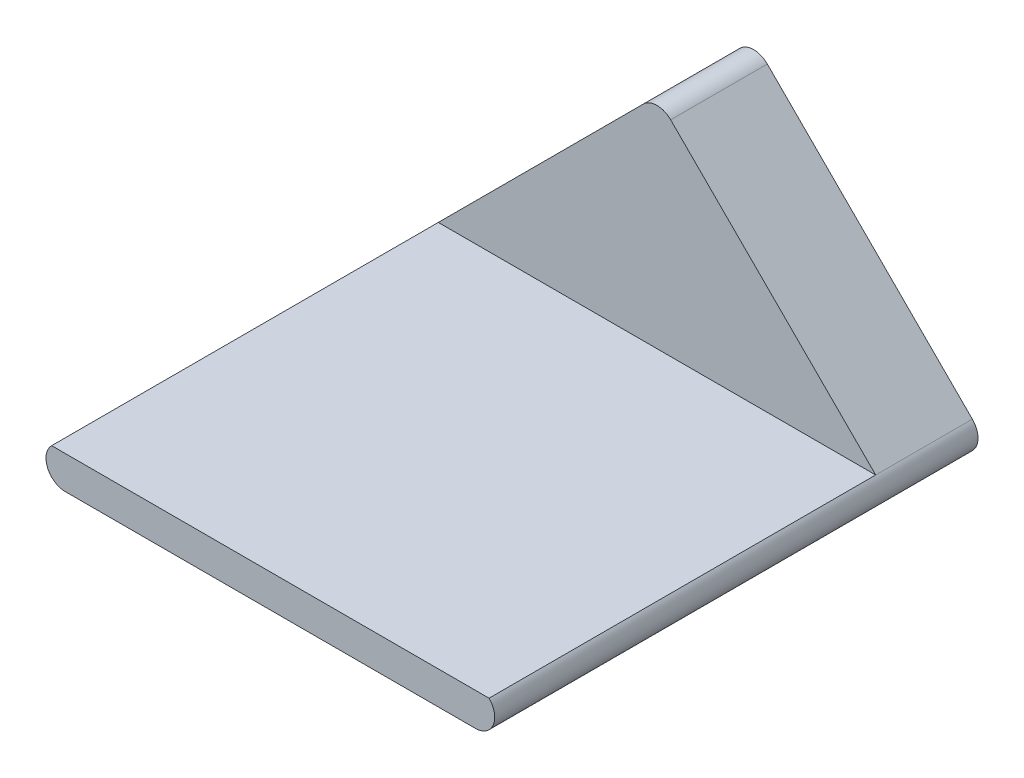
ISO-10303-21;
HEADER;
FILE_DESCRIPTION(('STEP AP214'),'2;1');
FILE_NAME('part.step','',(''),(''),'','','');
FILE_SCHEMA(('AUTOMOTIVE_DESIGN { 1 0 10303 214 1 1 1 1 }'));
ENDSEC;
DATA;
#1=APPLICATION_CONTEXT('core data for automotive mechanical design processes');
#2=APPLICATION_PROTOCOL_DEFINITION('international standard','automotive_design',2000,#1);
#3=PRODUCT_CONTEXT('',#1,'mechanical');
#4=PRODUCT('Part','Part','',(#3));
#5=PRODUCT_RELATED_PRODUCT_CATEGORY('part','',(#4));
#6=PRODUCT_DEFINITION_FORMATION('','',#4);
#7=PRODUCT_DEFINITION_CONTEXT('part definition',#1,'design');
#8=PRODUCT_DEFINITION('design','',#6,#7);
#9=PRODUCT_DEFINITION_SHAPE('','',#8);
#10=(LENGTH_UNIT() NAMED_UNIT(*) SI_UNIT(.MILLI.,.METRE.));
#11=(NAMED_UNIT(*) PLANE_ANGLE_UNIT() SI_UNIT($,.RADIAN.));
#12=(NAMED_UNIT(*) SI_UNIT($,.STERADIAN.) SOLID_ANGLE_UNIT());
#13=UNCERTAINTY_MEASURE_WITH_UNIT(LENGTH_MEASURE(1.E-05),#10,'distance_accuracy_value','');
#14=(GEOMETRIC_REPRESENTATION_CONTEXT(3) GLOBAL_UNCERTAINTY_ASSIGNED_CONTEXT((#13)) GLOBAL_UNIT_ASSIGNED_CONTEXT((#10,
#11,#12)) REPRESENTATION_CONTEXT('',''));
#15=CARTESIAN_POINT('',(0.,0.,0.));
#16=DIRECTION('',(0.,0.,1.));
#17=DIRECTION('',(1.,0.,0.));
#18=AXIS2_PLACEMENT_3D('',#15,#16,#17);
#19=CARTESIAN_POINT('',(0.,3.41421356237313,50.));
#20=DIRECTION('',(0.,1.,0.));
#21=DIRECTION('',(-1.,0.,0.));
#22=AXIS2_PLACEMENT_3D('',#19,#20,#21);
#23=PLANE('',#22);
#24=DIRECTION('',(1.,0.,0.));
#25=VECTOR('',#24,1.);
#26=CARTESIAN_POINT('',(0.,3.41421356237313,10.));
#27=LINE('',#26,#25);
#28=CARTESIAN_POINT('',(3.41421356237311,3.41421356237313,9.99999999999999));
#29=VERTEX_POINT('',#28);
#30=CARTESIAN_POINT('',(48.6690475583122,3.41421356237311,10.));
#31=VERTEX_POINT('',#30);
#32=EDGE_CURVE('E56',#29,#31,#27,.T.);
#33=ORIENTED_EDGE('',*,*,#32,.F.);
#34=DIRECTION('',(0.,0.,-1.));
#35=VECTOR('',#34,1.);
#36=CARTESIAN_POINT('',(3.41421356237311,3.41421356237313,50.));
#37=LINE('',#36,#35);
#38=CARTESIAN_POINT('',(3.41421356237311,3.41421356237313,50.));
#39=VERTEX_POINT('',#38);
#40=EDGE_CURVE('E11',#39,#29,#37,.T.);
#41=ORIENTED_EDGE('',*,*,#40,.F.);
#42=DIRECTION('',(1.,0.,0.));
#43=VECTOR('',#42,1.);
#44=CARTESIAN_POINT('',(0.,3.41421356237313,50.));
#45=LINE('',#44,#43);
#46=CARTESIAN_POINT('',(48.6690475583122,3.41421356237311,50.));
#47=VERTEX_POINT('',#46);
#48=EDGE_CURVE('E153',#39,#47,#45,.T.);
#49=ORIENTED_EDGE('',*,*,#48,.T.);
#50=DIRECTION('',(0.,0.,-1.));
#51=VECTOR('',#50,1.);
#52=CARTESIAN_POINT('',(48.6690475583122,3.41421356237311,50.));
#53=LINE('',#52,#51);
#54=EDGE_CURVE('E63',#47,#31,#53,.T.);
#55=ORIENTED_EDGE('',*,*,#54,.T.);
#56=EDGE_LOOP('',(#33,#41,#49,#55));
#57=FACE_BOUND('',#56,.T.);
#58=ADVANCED_FACE('F41',(#57),#23,.T.);
#59=CARTESIAN_POINT('',(4.82842712474618,2.,50.));
#60=DIRECTION('',(0.,0.,-1.));
#61=DIRECTION('',(-1.,0.,0.));
#62=AXIS2_PLACEMENT_3D('',#59,#60,#61);
#63=CYLINDRICAL_SURFACE('',#62,2.);
#64=CARTESIAN_POINT('',(4.82842712474618,2.,0.));
#65=DIRECTION('',(0.,0.,1.));
#66=DIRECTION('',(1.,0.,0.));
#67=AXIS2_PLACEMENT_3D('',#64,#65,#66);
#68=CIRCLE('',#67,2.);
#69=CARTESIAN_POINT('',(3.41421356237311,3.41421356237313,0.));
#70=VERTEX_POINT('',#69);
#71=CARTESIAN_POINT('',(4.82842712474623,0.,0.));
#72=VERTEX_POINT('',#71);
#73=EDGE_CURVE('E116',#70,#72,#68,.T.);
#74=ORIENTED_EDGE('',*,*,#73,.T.);
#75=DIRECTION('',(0.,0.,-1.));
#76=VECTOR('',#75,1.);
#77=CARTESIAN_POINT('',(4.82842712474623,0.,50.));
#78=LINE('',#77,#76);
#79=CARTESIAN_POINT('',(4.82842712474623,0.,50.));
#80=VERTEX_POINT('',#79);
#81=EDGE_CURVE('E49',#80,#72,#78,.T.);
#82=ORIENTED_EDGE('',*,*,#81,.F.);
#83=CARTESIAN_POINT('',(4.82842712474618,2.,50.));
#84=DIRECTION('',(0.,0.,1.));
#85=DIRECTION('',(1.,0.,0.));
#86=AXIS2_PLACEMENT_3D('',#83,#84,#85);
#87=CIRCLE('',#86,2.);
#88=EDGE_CURVE('E156',#39,#80,#87,.T.);
#89=ORIENTED_EDGE('',*,*,#88,.F.);
#90=ORIENTED_EDGE('',*,*,#40,.T.);
#91=DIRECTION('',(0.,0.,-1.));
#92=VECTOR('',#91,1.);
#93=CARTESIAN_POINT('',(3.41421356237311,3.41421356237313,10.));
#94=LINE('',#93,#92);
#95=EDGE_CURVE('E117',#29,#70,#94,.T.);
#96=ORIENTED_EDGE('',*,*,#95,.T.);
#97=EDGE_LOOP('',(#74,#82,#89,#90,#96));
#98=FACE_BOUND('',#97,.T.);
#99=ADVANCED_FACE('F187',(#98),#63,.T.);
#100=CARTESIAN_POINT('',(0.,0.,50.));
#101=DIRECTION('',(0.,-1.,0.));
#102=DIRECTION('',(1.,0.,0.));
#103=AXIS2_PLACEMENT_3D('',#100,#101,#102);
#104=PLANE('',#103);
#105=DIRECTION('',(-1.,0.,0.));
#106=VECTOR('',#105,1.);
#107=CARTESIAN_POINT('',(0.,0.,0.));
#108=LINE('',#107,#106);
#109=CARTESIAN_POINT('',(47.2548339959391,0.,0.));
#110=VERTEX_POINT('',#109);
#111=EDGE_CURVE('E169',#110,#72,#108,.T.);
#112=ORIENTED_EDGE('',*,*,#111,.F.);
#113=DIRECTION('',(0.,0.,-1.));
#114=VECTOR('',#113,1.);
#115=CARTESIAN_POINT('',(47.2548339959391,0.,50.));
#116=LINE('',#115,#114);
#117=CARTESIAN_POINT('',(47.2548339959391,0.,50.));
#118=VERTEX_POINT('',#117);
#119=EDGE_CURVE('E177',#118,#110,#116,.T.);
#120=ORIENTED_EDGE('',*,*,#119,.F.);
#121=DIRECTION('',(-1.,0.,0.));
#122=VECTOR('',#121,1.);
#123=CARTESIAN_POINT('',(0.,0.,50.));
#124=LINE('',#123,#122);
#125=EDGE_CURVE('E159',#118,#80,#124,.T.);
#126=ORIENTED_EDGE('',*,*,#125,.T.);
#127=ORIENTED_EDGE('',*,*,#81,.T.);
#128=EDGE_LOOP('',(#112,#120,#126,#127));
#129=FACE_BOUND('',#128,.T.);
#130=ADVANCED_FACE('F183',(#129),#104,.T.);
#131=CARTESIAN_POINT('',(47.2548339959391,2.00000000000001,50.));
#132=DIRECTION('',(0.,0.,-1.));
#133=DIRECTION('',(-1.,0.,0.));
#134=AXIS2_PLACEMENT_3D('',#131,#132,#133);
#135=CYLINDRICAL_SURFACE('',#134,2.);
#136=CARTESIAN_POINT('',(47.2548339959391,2.00000000000001,0.));
#137=DIRECTION('',(0.,0.,1.));
#138=DIRECTION('',(1.,0.,0.));
#139=AXIS2_PLACEMENT_3D('',#136,#137,#138);
#140=CIRCLE('',#139,2.);
#141=CARTESIAN_POINT('',(48.6690475583122,3.41421356237311,0.));
#142=VERTEX_POINT('',#141);
#143=EDGE_CURVE('E83',#142,#110,#140,.F.);
#144=ORIENTED_EDGE('',*,*,#143,.F.);
#145=DIRECTION('',(0.,0.,-1.));
#146=VECTOR('',#145,1.);
#147=CARTESIAN_POINT('',(48.6690475583122,3.41421356237311,10.));
#148=LINE('',#147,#146);
#149=EDGE_CURVE('E148',#31,#142,#148,.T.);
#150=ORIENTED_EDGE('',*,*,#149,.F.);
#151=ORIENTED_EDGE('',*,*,#54,.F.);
#152=CARTESIAN_POINT('',(47.2548339959391,2.00000000000001,50.));
#153=DIRECTION('',(0.,0.,1.));
#154=DIRECTION('',(1.,0.,0.));
#155=AXIS2_PLACEMENT_3D('',#152,#153,#154);
#156=CIRCLE('',#155,2.);
#157=EDGE_CURVE('E163',#47,#118,#156,.F.);
#158=ORIENTED_EDGE('',*,*,#157,.T.);
#159=ORIENTED_EDGE('',*,*,#119,.T.);
#160=EDGE_LOOP('',(#144,#150,#151,#158,#159));
#161=FACE_BOUND('',#160,.T.);
#162=ADVANCED_FACE('F193',(#161),#135,.T.);
#163=CARTESIAN_POINT('',(0.,0.,50.));
#164=DIRECTION('',(0.,0.,1.));
#165=DIRECTION('',(1.,0.,0.));
#166=AXIS2_PLACEMENT_3D('',#163,#164,#165);
#167=PLANE('',#166);
#168=ORIENTED_EDGE('',*,*,#48,.F.);
#169=ORIENTED_EDGE('',*,*,#88,.T.);
#170=ORIENTED_EDGE('',*,*,#125,.F.);
#171=ORIENTED_EDGE('',*,*,#157,.F.);
#172=EDGE_LOOP('',(#168,#169,#170,#171));
#173=FACE_BOUND('',#172,.T.);
#174=ADVANCED_FACE('F195',(#173),#167,.T.);
#175=CARTESIAN_POINT('',(0.,0.,0.));
#176=DIRECTION('',(0.,0.,1.));
#177=DIRECTION('',(1.,0.,0.));
#178=AXIS2_PLACEMENT_3D('',#175,#176,#177);
#179=PLANE('',#178);
#180=ORIENTED_EDGE('',*,*,#73,.F.);
#181=DIRECTION('',(0.707106781186547,0.707106781186548,0.));
#182=VECTOR('',#181,1.);
#183=CARTESIAN_POINT('',(0.,0.,0.));
#184=LINE('',#183,#182);
#185=CARTESIAN_POINT('',(24.6274169979695,24.6274169979696,0.));
#186=VERTEX_POINT('',#185);
#187=EDGE_CURVE('E140',#70,#186,#184,.T.);
#188=ORIENTED_EDGE('',*,*,#187,.T.);
#189=CARTESIAN_POINT('',(26.0416305603426,23.2132034355965,0.));
#190=DIRECTION('',(0.,0.,1.));
#191=DIRECTION('',(1.,0.,0.));
#192=AXIS2_PLACEMENT_3D('',#189,#190,#191);
#193=CIRCLE('',#192,2.);
#194=CARTESIAN_POINT('',(27.4558441227157,24.6274169979695,0.));
#195=VERTEX_POINT('',#194);
#196=EDGE_CURVE('E110',#186,#195,#193,.F.);
#197=ORIENTED_EDGE('',*,*,#196,.T.);
#198=DIRECTION('',(0.707106781186548,-0.707106781186547,0.));
#199=VECTOR('',#198,1.);
#200=CARTESIAN_POINT('',(26.0416305603426,26.0416305603426,0.));
#201=LINE('',#200,#199);
#202=EDGE_CURVE('E126',#195,#142,#201,.T.);
#203=ORIENTED_EDGE('',*,*,#202,.T.);
#204=ORIENTED_EDGE('',*,*,#143,.T.);
#205=ORIENTED_EDGE('',*,*,#111,.T.);
#206=EDGE_LOOP('',(#180,#188,#197,#203,#204,#205));
#207=FACE_BOUND('',#206,.T.);
#208=ADVANCED_FACE('F189',(#207),#179,.F.);
#209=CARTESIAN_POINT('',(26.0416305603426,23.2132034355965,10.));
#210=DIRECTION('',(0.,0.,-1.));
#211=DIRECTION('',(-1.,0.,0.));
#212=AXIS2_PLACEMENT_3D('',#209,#210,#211);
#213=CYLINDRICAL_SURFACE('',#212,2.);
#214=ORIENTED_EDGE('',*,*,#196,.F.);
#215=DIRECTION('',(0.,0.,-1.));
#216=VECTOR('',#215,1.);
#217=CARTESIAN_POINT('',(24.6274169979695,24.6274169979696,10.));
#218=LINE('',#217,#216);
#219=CARTESIAN_POINT('',(24.6274169979695,24.6274169979696,10.));
#220=VERTEX_POINT('',#219);
#221=EDGE_CURVE('E104',#220,#186,#218,.T.);
#222=ORIENTED_EDGE('',*,*,#221,.F.);
#223=CARTESIAN_POINT('',(26.0416305603426,23.2132034355965,10.));
#224=DIRECTION('',(0.,0.,1.));
#225=DIRECTION('',(1.,0.,0.));
#226=AXIS2_PLACEMENT_3D('',#223,#224,#225);
#227=CIRCLE('',#226,2.);
#228=CARTESIAN_POINT('',(27.4558441227157,24.6274169979695,10.));
#229=VERTEX_POINT('',#228);
#230=EDGE_CURVE('E107',#220,#229,#227,.F.);
#231=ORIENTED_EDGE('',*,*,#230,.T.);
#232=DIRECTION('',(0.,0.,-1.));
#233=VECTOR('',#232,1.);
#234=CARTESIAN_POINT('',(27.4558441227157,24.6274169979695,10.));
#235=LINE('',#234,#233);
#236=EDGE_CURVE('E137',#229,#195,#235,.T.);
#237=ORIENTED_EDGE('',*,*,#236,.T.);
#238=EDGE_LOOP('',(#214,#222,#231,#237));
#239=FACE_BOUND('',#238,.T.);
#240=ADVANCED_FACE('F106',(#239),#213,.T.);
#241=CARTESIAN_POINT('',(0.,0.,10.));
#242=DIRECTION('',(-0.707106781186548,0.707106781186547,0.));
#243=DIRECTION('',(-0.707106781186547,-0.707106781186548,0.));
#244=AXIS2_PLACEMENT_3D('',#241,#242,#243);
#245=PLANE('',#244);
#246=ORIENTED_EDGE('',*,*,#187,.F.);
#247=ORIENTED_EDGE('',*,*,#95,.F.);
#248=DIRECTION('',(0.707106781186547,0.707106781186548,0.));
#249=VECTOR('',#248,1.);
#250=CARTESIAN_POINT('',(0.,0.,10.));
#251=LINE('',#250,#249);
#252=EDGE_CURVE('E122',#29,#220,#251,.T.);
#253=ORIENTED_EDGE('',*,*,#252,.T.);
#254=ORIENTED_EDGE('',*,*,#221,.T.);
#255=EDGE_LOOP('',(#246,#247,#253,#254));
#256=FACE_BOUND('',#255,.T.);
#257=ADVANCED_FACE('F129',(#256),#245,.T.);
#258=CARTESIAN_POINT('',(26.0416305603426,26.0416305603426,10.));
#259=DIRECTION('',(0.707106781186547,0.707106781186548,0.));
#260=DIRECTION('',(-0.707106781186548,0.707106781186547,0.));
#261=AXIS2_PLACEMENT_3D('',#258,#259,#260);
#262=PLANE('',#261);
#263=ORIENTED_EDGE('',*,*,#202,.F.);
#264=ORIENTED_EDGE('',*,*,#236,.F.);
#265=DIRECTION('',(0.707106781186548,-0.707106781186547,0.));
#266=VECTOR('',#265,1.);
#267=CARTESIAN_POINT('',(26.0416305603426,26.0416305603426,10.));
#268=LINE('',#267,#266);
#269=EDGE_CURVE('E124',#229,#31,#268,.T.);
#270=ORIENTED_EDGE('',*,*,#269,.T.);
#271=ORIENTED_EDGE('',*,*,#149,.T.);
#272=EDGE_LOOP('',(#263,#264,#270,#271));
#273=FACE_BOUND('',#272,.T.);
#274=ADVANCED_FACE('F192',(#273),#262,.T.);
#275=CARTESIAN_POINT('',(0.,0.,10.));
#276=DIRECTION('',(0.,0.,1.));
#277=DIRECTION('',(1.,0.,0.));
#278=AXIS2_PLACEMENT_3D('',#275,#276,#277);
#279=PLANE('',#278);
#280=ORIENTED_EDGE('',*,*,#230,.F.);
#281=ORIENTED_EDGE('',*,*,#252,.F.);
#282=ORIENTED_EDGE('',*,*,#32,.T.);
#283=ORIENTED_EDGE('',*,*,#269,.F.);
#284=EDGE_LOOP('',(#280,#281,#282,#283));
#285=FACE_BOUND('',#284,.T.);
#286=ADVANCED_FACE('F121',(#285),#279,.T.);
#287=CLOSED_SHELL('',(#58,#99,#130,#162,#174,#208,#240,#257,#274,#286));
#288=MANIFOLD_SOLID_BREP('B2',#287);
#289=ADVANCED_BREP_SHAPE_REPRESENTATION('',(#18,#288),#14);
#290=SHAPE_DEFINITION_REPRESENTATION(#9,#289);
ENDSEC;
END-ISO-10303-21;
